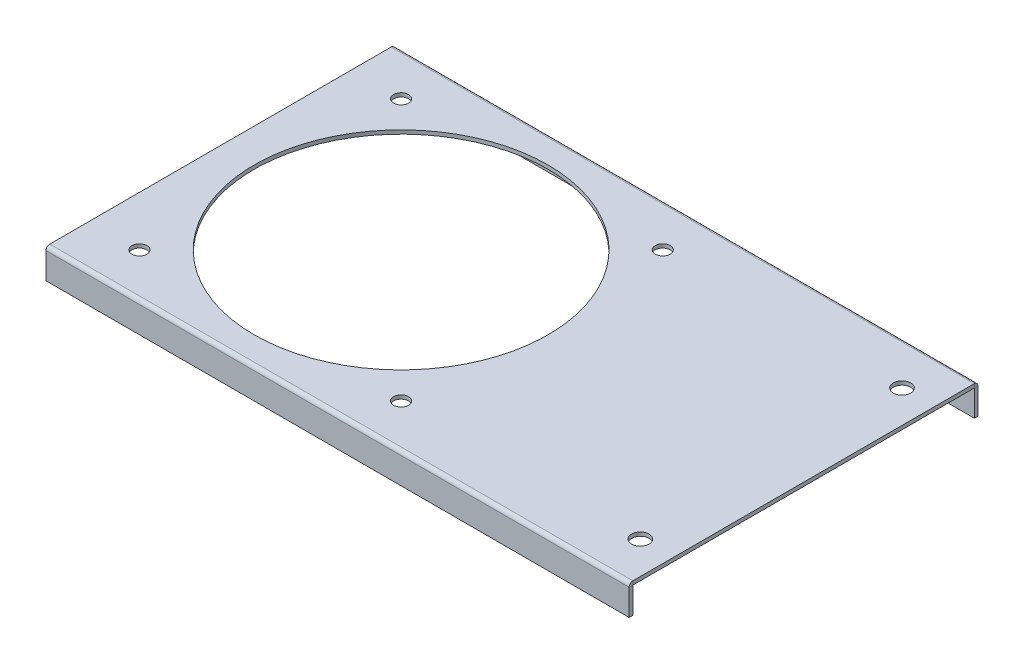
ISO-10303-21;
HEADER;
FILE_DESCRIPTION(('STEP AP214'),'2;1');
FILE_NAME('part.step','',(''),(''),'','','');
FILE_SCHEMA(('AUTOMOTIVE_DESIGN { 1 0 10303 214 1 1 1 1 }'));
ENDSEC;
DATA;
#1=APPLICATION_CONTEXT('core data for automotive mechanical design processes');
#2=APPLICATION_PROTOCOL_DEFINITION('international standard','automotive_design',2000,#1);
#3=PRODUCT_CONTEXT('',#1,'mechanical');
#4=PRODUCT('Part','Part','',(#3));
#5=PRODUCT_RELATED_PRODUCT_CATEGORY('part','',(#4));
#6=PRODUCT_DEFINITION_FORMATION('','',#4);
#7=PRODUCT_DEFINITION_CONTEXT('part definition',#1,'design');
#8=PRODUCT_DEFINITION('design','',#6,#7);
#9=PRODUCT_DEFINITION_SHAPE('','',#8);
#10=(LENGTH_UNIT() NAMED_UNIT(*) SI_UNIT(.MILLI.,.METRE.));
#11=(NAMED_UNIT(*) PLANE_ANGLE_UNIT() SI_UNIT($,.RADIAN.));
#12=(NAMED_UNIT(*) SI_UNIT($,.STERADIAN.) SOLID_ANGLE_UNIT());
#13=UNCERTAINTY_MEASURE_WITH_UNIT(LENGTH_MEASURE(1.E-05),#10,'distance_accuracy_value','');
#14=(GEOMETRIC_REPRESENTATION_CONTEXT(3) GLOBAL_UNCERTAINTY_ASSIGNED_CONTEXT((#13)) GLOBAL_UNIT_ASSIGNED_CONTEXT((#10,
#11,#12)) REPRESENTATION_CONTEXT('',''));
#15=CARTESIAN_POINT('',(0.,0.,0.));
#16=DIRECTION('',(0.,0.,1.));
#17=DIRECTION('',(1.,0.,0.));
#18=AXIS2_PLACEMENT_3D('',#15,#16,#17);
#19=CARTESIAN_POINT('',(117.,-1.5,68.5));
#20=DIRECTION('',(1.,0.,0.));
#21=DIRECTION('',(0.,0.,-1.));
#22=AXIS2_PLACEMENT_3D('',#19,#20,#21);
#23=PLANE('',#22);
#24=DIRECTION('',(0.,1.,0.));
#25=VECTOR('',#24,1.);
#26=CARTESIAN_POINT('',(117.,-1.5,68.5));
#27=LINE('',#26,#25);
#28=CARTESIAN_POINT('',(117.,-1.5,68.5));
#29=VERTEX_POINT('',#28);
#30=CARTESIAN_POINT('',(117.,0.,68.5));
#31=VERTEX_POINT('',#30);
#32=EDGE_CURVE('E11',#29,#31,#27,.T.);
#33=ORIENTED_EDGE('',*,*,#32,.F.);
#34=DIRECTION('',(0.,0.,-1.));
#35=VECTOR('',#34,1.);
#36=CARTESIAN_POINT('',(117.,-1.5,70.));
#37=LINE('',#36,#35);
#38=CARTESIAN_POINT('',(117.,-1.49999999999998,-68.5));
#39=VERTEX_POINT('',#38);
#40=EDGE_CURVE('E141',#29,#39,#37,.T.);
#41=ORIENTED_EDGE('',*,*,#40,.T.);
#42=DIRECTION('',(0.,1.,0.));
#43=VECTOR('',#42,1.);
#44=CARTESIAN_POINT('',(117.,-1.49999999999998,-68.5));
#45=LINE('',#44,#43);
#46=CARTESIAN_POINT('',(117.,0.,-68.5));
#47=VERTEX_POINT('',#46);
#48=EDGE_CURVE('E204',#39,#47,#45,.T.);
#49=ORIENTED_EDGE('',*,*,#48,.T.);
#50=DIRECTION('',(0.,0.,-1.));
#51=VECTOR('',#50,1.);
#52=CARTESIAN_POINT('',(117.,0.,70.));
#53=LINE('',#52,#51);
#54=EDGE_CURVE('E262',#31,#47,#53,.T.);
#55=ORIENTED_EDGE('',*,*,#54,.F.);
#56=EDGE_LOOP('',(#33,#41,#49,#55));
#57=FACE_BOUND('',#56,.T.);
#58=ADVANCED_FACE('F35',(#57),#23,.T.);
#59=CARTESIAN_POINT('',(117.,-1.5,68.5));
#60=DIRECTION('',(1.,0.,0.));
#61=DIRECTION('',(0.,0.,-1.));
#62=AXIS2_PLACEMENT_3D('',#59,#60,#61);
#63=PLANE('',#62);
#64=DIRECTION('',(0.,0.,1.));
#65=VECTOR('',#64,1.);
#66=CARTESIAN_POINT('',(117.,-1.5,68.5));
#67=LINE('',#66,#65);
#68=CARTESIAN_POINT('',(117.,-1.5,70.));
#69=VERTEX_POINT('',#68);
#70=EDGE_CURVE('E44',#29,#69,#67,.T.);
#71=ORIENTED_EDGE('',*,*,#70,.F.);
#72=ORIENTED_EDGE('',*,*,#32,.T.);
#73=CARTESIAN_POINT('',(117.,-1.5,68.5));
#74=DIRECTION('',(1.,0.,0.));
#75=DIRECTION('',(0.,0.,-1.));
#76=AXIS2_PLACEMENT_3D('',#73,#74,#75);
#77=CIRCLE('',#76,1.5);
#78=EDGE_CURVE('E148',#69,#31,#77,.F.);
#79=ORIENTED_EDGE('',*,*,#78,.F.);
#80=EDGE_LOOP('',(#71,#72,#79));
#81=FACE_BOUND('',#80,.T.);
#82=ADVANCED_FACE('F274',(#81),#63,.T.);
#83=CARTESIAN_POINT('',(-117.,-1.5,68.5));
#84=DIRECTION('',(-1.,0.,0.));
#85=DIRECTION('',(0.,0.,1.));
#86=AXIS2_PLACEMENT_3D('',#83,#84,#85);
#87=PLANE('',#86);
#88=DIRECTION('',(0.,0.,1.));
#89=VECTOR('',#88,1.);
#90=CARTESIAN_POINT('',(-117.,-1.5,68.5));
#91=LINE('',#90,#89);
#92=CARTESIAN_POINT('',(-117.,-1.5,68.5));
#93=VERTEX_POINT('',#92);
#94=CARTESIAN_POINT('',(-117.,-1.5,70.));
#95=VERTEX_POINT('',#94);
#96=EDGE_CURVE('E88',#93,#95,#91,.T.);
#97=ORIENTED_EDGE('',*,*,#96,.F.);
#98=DIRECTION('',(0.,1.,0.));
#99=VECTOR('',#98,1.);
#100=CARTESIAN_POINT('',(-117.,-12.,68.5));
#101=LINE('',#100,#99);
#102=CARTESIAN_POINT('',(-117.,-12.,68.5));
#103=VERTEX_POINT('',#102);
#104=EDGE_CURVE('E176',#103,#93,#101,.T.);
#105=ORIENTED_EDGE('',*,*,#104,.F.);
#106=DIRECTION('',(0.,0.,1.));
#107=VECTOR('',#106,1.);
#108=CARTESIAN_POINT('',(-117.,-12.,68.5));
#109=LINE('',#108,#107);
#110=CARTESIAN_POINT('',(-117.,-12.,70.));
#111=VERTEX_POINT('',#110);
#112=EDGE_CURVE('E128',#103,#111,#109,.T.);
#113=ORIENTED_EDGE('',*,*,#112,.T.);
#114=DIRECTION('',(0.,1.,0.));
#115=VECTOR('',#114,1.);
#116=CARTESIAN_POINT('',(-117.,-12.,70.));
#117=LINE('',#116,#115);
#118=EDGE_CURVE('E173',#111,#95,#117,.T.);
#119=ORIENTED_EDGE('',*,*,#118,.T.);
#120=EDGE_LOOP('',(#97,#105,#113,#119));
#121=FACE_BOUND('',#120,.T.);
#122=ADVANCED_FACE('F278',(#121),#87,.T.);
#123=CARTESIAN_POINT('',(-117.,-1.5,68.5));
#124=DIRECTION('',(-1.,0.,0.));
#125=DIRECTION('',(0.,0.,1.));
#126=AXIS2_PLACEMENT_3D('',#123,#124,#125);
#127=PLANE('',#126);
#128=DIRECTION('',(0.,1.,0.));
#129=VECTOR('',#128,1.);
#130=CARTESIAN_POINT('',(-117.,-1.5,68.5));
#131=LINE('',#130,#129);
#132=CARTESIAN_POINT('',(-117.,0.,68.5));
#133=VERTEX_POINT('',#132);
#134=EDGE_CURVE('E207',#93,#133,#131,.T.);
#135=ORIENTED_EDGE('',*,*,#134,.F.);
#136=ORIENTED_EDGE('',*,*,#96,.T.);
#137=CARTESIAN_POINT('',(-117.,-1.5,68.5));
#138=DIRECTION('',(1.,0.,0.));
#139=DIRECTION('',(0.,0.,-1.));
#140=AXIS2_PLACEMENT_3D('',#137,#138,#139);
#141=CIRCLE('',#140,1.5);
#142=EDGE_CURVE('E170',#95,#133,#141,.F.);
#143=ORIENTED_EDGE('',*,*,#142,.T.);
#144=EDGE_LOOP('',(#135,#136,#143));
#145=FACE_BOUND('',#144,.T.);
#146=ADVANCED_FACE('F284',(#145),#127,.T.);
#147=CARTESIAN_POINT('',(117.,-1.49999999999998,-68.5));
#148=DIRECTION('',(1.,0.,0.));
#149=DIRECTION('',(0.,0.,-1.));
#150=AXIS2_PLACEMENT_3D('',#147,#148,#149);
#151=PLANE('',#150);
#152=DIRECTION('',(0.,0.,-1.));
#153=VECTOR('',#152,1.);
#154=CARTESIAN_POINT('',(117.,-1.49999999999998,-68.5));
#155=LINE('',#154,#153);
#156=CARTESIAN_POINT('',(117.,-1.49999999999998,-70.));
#157=VERTEX_POINT('',#156);
#158=EDGE_CURVE('E53',#39,#157,#155,.T.);
#159=ORIENTED_EDGE('',*,*,#158,.F.);
#160=DIRECTION('',(0.,1.,0.));
#161=VECTOR('',#160,1.);
#162=CARTESIAN_POINT('',(117.,0.,-68.5));
#163=LINE('',#162,#161);
#164=CARTESIAN_POINT('',(117.,-12.,-68.5));
#165=VERTEX_POINT('',#164);
#166=EDGE_CURVE('E101',#39,#165,#163,.F.);
#167=ORIENTED_EDGE('',*,*,#166,.T.);
#168=DIRECTION('',(0.,0.,1.));
#169=VECTOR('',#168,1.);
#170=CARTESIAN_POINT('',(117.,-12.,-70.));
#171=LINE('',#170,#169);
#172=CARTESIAN_POINT('',(117.,-12.,-70.));
#173=VERTEX_POINT('',#172);
#174=EDGE_CURVE('E253',#173,#165,#171,.T.);
#175=ORIENTED_EDGE('',*,*,#174,.F.);
#176=DIRECTION('',(0.,-1.,0.));
#177=VECTOR('',#176,1.);
#178=CARTESIAN_POINT('',(117.,0.,-70.));
#179=LINE('',#178,#177);
#180=EDGE_CURVE('E256',#157,#173,#179,.T.);
#181=ORIENTED_EDGE('',*,*,#180,.F.);
#182=EDGE_LOOP('',(#159,#167,#175,#181));
#183=FACE_BOUND('',#182,.T.);
#184=ADVANCED_FACE('F286',(#183),#151,.T.);
#185=CARTESIAN_POINT('',(117.,-1.49999999999998,-68.5));
#186=DIRECTION('',(1.,0.,0.));
#187=DIRECTION('',(0.,0.,-1.));
#188=AXIS2_PLACEMENT_3D('',#185,#186,#187);
#189=PLANE('',#188);
#190=ORIENTED_EDGE('',*,*,#48,.F.);
#191=ORIENTED_EDGE('',*,*,#158,.T.);
#192=CARTESIAN_POINT('',(117.,-1.49999999999998,-68.5));
#193=DIRECTION('',(1.,0.,0.));
#194=DIRECTION('',(0.,0.,-1.));
#195=AXIS2_PLACEMENT_3D('',#192,#193,#194);
#196=CIRCLE('',#195,1.5);
#197=EDGE_CURVE('E259',#47,#157,#196,.F.);
#198=ORIENTED_EDGE('',*,*,#197,.F.);
#199=EDGE_LOOP('',(#190,#191,#198));
#200=FACE_BOUND('',#199,.T.);
#201=ADVANCED_FACE('F292',(#200),#189,.T.);
#202=CARTESIAN_POINT('',(-117.,-1.49999999999998,-68.5));
#203=DIRECTION('',(-1.,0.,0.));
#204=DIRECTION('',(0.,0.,1.));
#205=AXIS2_PLACEMENT_3D('',#202,#203,#204);
#206=PLANE('',#205);
#207=DIRECTION('',(0.,1.,0.));
#208=VECTOR('',#207,1.);
#209=CARTESIAN_POINT('',(-117.,-1.49999999999998,-68.5));
#210=LINE('',#209,#208);
#211=CARTESIAN_POINT('',(-117.,-1.49999999999998,-68.5));
#212=VERTEX_POINT('',#211);
#213=CARTESIAN_POINT('',(-117.,0.,-68.5));
#214=VERTEX_POINT('',#213);
#215=EDGE_CURVE('E95',#212,#214,#210,.T.);
#216=ORIENTED_EDGE('',*,*,#215,.F.);
#217=DIRECTION('',(0.,0.,-1.));
#218=VECTOR('',#217,1.);
#219=CARTESIAN_POINT('',(-117.,-1.5,70.));
#220=LINE('',#219,#218);
#221=EDGE_CURVE('E178',#93,#212,#220,.T.);
#222=ORIENTED_EDGE('',*,*,#221,.F.);
#223=ORIENTED_EDGE('',*,*,#134,.T.);
#224=DIRECTION('',(0.,0.,-1.));
#225=VECTOR('',#224,1.);
#226=CARTESIAN_POINT('',(-117.,0.,70.));
#227=LINE('',#226,#225);
#228=EDGE_CURVE('E168',#133,#214,#227,.T.);
#229=ORIENTED_EDGE('',*,*,#228,.T.);
#230=EDGE_LOOP('',(#216,#222,#223,#229));
#231=FACE_BOUND('',#230,.T.);
#232=ADVANCED_FACE('F282',(#231),#206,.T.);
#233=CARTESIAN_POINT('',(-117.,-1.49999999999998,-68.5));
#234=DIRECTION('',(-1.,0.,0.));
#235=DIRECTION('',(0.,0.,1.));
#236=AXIS2_PLACEMENT_3D('',#233,#234,#235);
#237=PLANE('',#236);
#238=DIRECTION('',(0.,0.,-1.));
#239=VECTOR('',#238,1.);
#240=CARTESIAN_POINT('',(-117.,-1.49999999999998,-68.5));
#241=LINE('',#240,#239);
#242=CARTESIAN_POINT('',(-117.,-1.49999999999998,-70.));
#243=VERTEX_POINT('',#242);
#244=EDGE_CURVE('E201',#212,#243,#241,.T.);
#245=ORIENTED_EDGE('',*,*,#244,.F.);
#246=ORIENTED_EDGE('',*,*,#215,.T.);
#247=CARTESIAN_POINT('',(-117.,-1.49999999999998,-68.5));
#248=DIRECTION('',(1.,0.,0.));
#249=DIRECTION('',(0.,0.,-1.));
#250=AXIS2_PLACEMENT_3D('',#247,#248,#249);
#251=CIRCLE('',#250,1.5);
#252=EDGE_CURVE('E165',#214,#243,#251,.F.);
#253=ORIENTED_EDGE('',*,*,#252,.T.);
#254=EDGE_LOOP('',(#245,#246,#253));
#255=FACE_BOUND('',#254,.T.);
#256=ADVANCED_FACE('F311',(#255),#237,.T.);
#257=CARTESIAN_POINT('',(117.,0.,-68.5));
#258=DIRECTION('',(0.,0.,-1.));
#259=DIRECTION('',(-1.,0.,0.));
#260=AXIS2_PLACEMENT_3D('',#257,#258,#259);
#261=PLANE('',#260);
#262=DIRECTION('',(0.,1.,0.));
#263=VECTOR('',#262,1.);
#264=CARTESIAN_POINT('',(-117.,0.,-68.5));
#265=LINE('',#264,#263);
#266=CARTESIAN_POINT('',(-117.,-12.,-68.5));
#267=VERTEX_POINT('',#266);
#268=EDGE_CURVE('E155',#212,#267,#265,.F.);
#269=ORIENTED_EDGE('',*,*,#268,.T.);
#270=DIRECTION('',(-1.,0.,0.));
#271=VECTOR('',#270,1.);
#272=CARTESIAN_POINT('',(117.,-12.,-68.5));
#273=LINE('',#272,#271);
#274=EDGE_CURVE('E199',#165,#267,#273,.T.);
#275=ORIENTED_EDGE('',*,*,#274,.F.);
#276=ORIENTED_EDGE('',*,*,#166,.F.);
#277=DIRECTION('',(-1.,0.,0.));
#278=VECTOR('',#277,1.);
#279=CARTESIAN_POINT('',(117.,-1.49999999999998,-68.5));
#280=LINE('',#279,#278);
#281=EDGE_CURVE('E154',#39,#212,#280,.T.);
#282=ORIENTED_EDGE('',*,*,#281,.T.);
#283=EDGE_LOOP('',(#269,#275,#276,#282));
#284=FACE_BOUND('',#283,.T.);
#285=ADVANCED_FACE('F317',(#284),#261,.F.);
#286=CARTESIAN_POINT('',(117.,-12.,-70.));
#287=DIRECTION('',(0.,-1.,0.));
#288=DIRECTION('',(0.,0.,-1.));
#289=AXIS2_PLACEMENT_3D('',#286,#287,#288);
#290=PLANE('',#289);
#291=DIRECTION('',(0.,0.,1.));
#292=VECTOR('',#291,1.);
#293=CARTESIAN_POINT('',(-117.,-12.,-70.));
#294=LINE('',#293,#292);
#295=CARTESIAN_POINT('',(-117.,-12.,-70.));
#296=VERTEX_POINT('',#295);
#297=EDGE_CURVE('E158',#296,#267,#294,.T.);
#298=ORIENTED_EDGE('',*,*,#297,.F.);
#299=DIRECTION('',(-1.,0.,0.));
#300=VECTOR('',#299,1.);
#301=CARTESIAN_POINT('',(117.,-12.,-70.));
#302=LINE('',#301,#300);
#303=EDGE_CURVE('E197',#173,#296,#302,.T.);
#304=ORIENTED_EDGE('',*,*,#303,.F.);
#305=ORIENTED_EDGE('',*,*,#174,.T.);
#306=ORIENTED_EDGE('',*,*,#274,.T.);
#307=EDGE_LOOP('',(#298,#304,#305,#306));
#308=FACE_BOUND('',#307,.T.);
#309=ADVANCED_FACE('F319',(#308),#290,.T.);
#310=CARTESIAN_POINT('',(117.,0.,-70.));
#311=DIRECTION('',(0.,0.,-1.));
#312=DIRECTION('',(-1.,0.,0.));
#313=AXIS2_PLACEMENT_3D('',#310,#311,#312);
#314=PLANE('',#313);
#315=DIRECTION('',(0.,-1.,0.));
#316=VECTOR('',#315,1.);
#317=CARTESIAN_POINT('',(-117.,0.,-70.));
#318=LINE('',#317,#316);
#319=EDGE_CURVE('E162',#243,#296,#318,.T.);
#320=ORIENTED_EDGE('',*,*,#319,.F.);
#321=DIRECTION('',(-1.,0.,0.));
#322=VECTOR('',#321,1.);
#323=CARTESIAN_POINT('',(117.,-1.49999999999998,-70.));
#324=LINE('',#323,#322);
#325=EDGE_CURVE('E194',#157,#243,#324,.T.);
#326=ORIENTED_EDGE('',*,*,#325,.F.);
#327=ORIENTED_EDGE('',*,*,#180,.T.);
#328=ORIENTED_EDGE('',*,*,#303,.T.);
#329=EDGE_LOOP('',(#320,#326,#327,#328));
#330=FACE_BOUND('',#329,.T.);
#331=ADVANCED_FACE('F321',(#330),#314,.T.);
#332=CARTESIAN_POINT('',(117.,-1.49999999999998,-68.5));
#333=DIRECTION('',(-1.,0.,0.));
#334=DIRECTION('',(0.,0.,1.));
#335=AXIS2_PLACEMENT_3D('',#332,#333,#334);
#336=CYLINDRICAL_SURFACE('',#335,1.5);
#337=ORIENTED_EDGE('',*,*,#252,.F.);
#338=DIRECTION('',(-1.,0.,0.));
#339=VECTOR('',#338,1.);
#340=CARTESIAN_POINT('',(117.,0.,-68.5));
#341=LINE('',#340,#339);
#342=EDGE_CURVE('E191',#47,#214,#341,.T.);
#343=ORIENTED_EDGE('',*,*,#342,.F.);
#344=ORIENTED_EDGE('',*,*,#197,.T.);
#345=ORIENTED_EDGE('',*,*,#325,.T.);
#346=EDGE_LOOP('',(#337,#343,#344,#345));
#347=FACE_BOUND('',#346,.T.);
#348=ADVANCED_FACE('F307',(#347),#336,.T.);
#349=CARTESIAN_POINT('',(117.,0.,70.));
#350=DIRECTION('',(0.,1.,0.));
#351=DIRECTION('',(0.,0.,1.));
#352=AXIS2_PLACEMENT_3D('',#349,#350,#351);
#353=PLANE('',#352);
#354=CARTESIAN_POINT('',(104.,0.,52.5));
#355=DIRECTION('',(0.,1.,0.));
#356=DIRECTION('',(0.,0.,1.));
#357=AXIS2_PLACEMENT_3D('',#354,#355,#356);
#358=CIRCLE('',#357,3.50000000000001);
#359=CARTESIAN_POINT('',(104.,0.,56.));
#360=VERTEX_POINT('',#359);
#361=EDGE_CURVE('E241',#360,#360,#358,.T.);
#362=ORIENTED_EDGE('',*,*,#361,.F.);
#363=EDGE_LOOP('',(#362));
#364=FACE_BOUND('',#363,.T.);
#365=CARTESIAN_POINT('',(104.,0.,-52.5));
#366=DIRECTION('',(0.,1.,0.));
#367=DIRECTION('',(0.,0.,1.));
#368=AXIS2_PLACEMENT_3D('',#365,#366,#367);
#369=CIRCLE('',#368,3.50000000000001);
#370=CARTESIAN_POINT('',(104.,0.,-49.));
#371=VERTEX_POINT('',#370);
#372=EDGE_CURVE('E231',#371,#371,#369,.T.);
#373=ORIENTED_EDGE('',*,*,#372,.F.);
#374=EDGE_LOOP('',(#373));
#375=FACE_BOUND('',#374,.T.);
#376=CARTESIAN_POINT('',(-97.,0.,52.5));
#377=DIRECTION('',(0.,1.,0.));
#378=DIRECTION('',(0.,0.,1.));
#379=AXIS2_PLACEMENT_3D('',#376,#377,#378);
#380=CIRCLE('',#379,3.00000000000001);
#381=CARTESIAN_POINT('',(-97.,0.,55.5));
#382=VERTEX_POINT('',#381);
#383=EDGE_CURVE('E228',#382,#382,#380,.T.);
#384=ORIENTED_EDGE('',*,*,#383,.F.);
#385=EDGE_LOOP('',(#384));
#386=FACE_BOUND('',#385,.T.);
#387=CARTESIAN_POINT('',(7.99999999999999,0.,52.5));
#388=DIRECTION('',(0.,1.,0.));
#389=DIRECTION('',(0.,0.,1.));
#390=AXIS2_PLACEMENT_3D('',#387,#388,#389);
#391=CIRCLE('',#390,3.);
#392=CARTESIAN_POINT('',(7.99999999999999,0.,55.5));
#393=VERTEX_POINT('',#392);
#394=EDGE_CURVE('E225',#393,#393,#391,.T.);
#395=ORIENTED_EDGE('',*,*,#394,.F.);
#396=EDGE_LOOP('',(#395));
#397=FACE_BOUND('',#396,.T.);
#398=CARTESIAN_POINT('',(7.99999999999998,0.,-52.5));
#399=DIRECTION('',(0.,1.,0.));
#400=DIRECTION('',(0.,0.,1.));
#401=AXIS2_PLACEMENT_3D('',#398,#399,#400);
#402=CIRCLE('',#401,3.);
#403=CARTESIAN_POINT('',(7.99999999999998,0.,-49.5));
#404=VERTEX_POINT('',#403);
#405=EDGE_CURVE('E221',#404,#404,#402,.T.);
#406=ORIENTED_EDGE('',*,*,#405,.F.);
#407=EDGE_LOOP('',(#406));
#408=FACE_BOUND('',#407,.T.);
#409=CARTESIAN_POINT('',(-97.,0.,-52.5));
#410=DIRECTION('',(0.,1.,0.));
#411=DIRECTION('',(0.,0.,1.));
#412=AXIS2_PLACEMENT_3D('',#409,#410,#411);
#413=CIRCLE('',#412,3.00000000000001);
#414=CARTESIAN_POINT('',(-97.,0.,-49.5));
#415=VERTEX_POINT('',#414);
#416=EDGE_CURVE('E217',#415,#415,#413,.T.);
#417=ORIENTED_EDGE('',*,*,#416,.F.);
#418=EDGE_LOOP('',(#417));
#419=FACE_BOUND('',#418,.T.);
#420=CARTESIAN_POINT('',(-44.5,0.,0.));
#421=DIRECTION('',(0.,1.,0.));
#422=DIRECTION('',(0.,0.,1.));
#423=AXIS2_PLACEMENT_3D('',#420,#421,#422);
#424=CIRCLE('',#423,59.);
#425=CARTESIAN_POINT('',(-44.5,0.,59.));
#426=VERTEX_POINT('',#425);
#427=EDGE_CURVE('E213',#426,#426,#424,.T.);
#428=ORIENTED_EDGE('',*,*,#427,.F.);
#429=EDGE_LOOP('',(#428));
#430=FACE_BOUND('',#429,.T.);
#431=ORIENTED_EDGE('',*,*,#228,.F.);
#432=DIRECTION('',(-1.,0.,0.));
#433=VECTOR('',#432,1.);
#434=CARTESIAN_POINT('',(117.,0.,68.5));
#435=LINE('',#434,#433);
#436=EDGE_CURVE('E188',#31,#133,#435,.T.);
#437=ORIENTED_EDGE('',*,*,#436,.F.);
#438=ORIENTED_EDGE('',*,*,#54,.T.);
#439=ORIENTED_EDGE('',*,*,#342,.T.);
#440=EDGE_LOOP('',(#431,#437,#438,#439));
#441=FACE_BOUND('',#440,.T.);
#442=ADVANCED_FACE('F303',(#364,#375,#386,#397,#408,#419,#430,#441),#353,.T.);
#443=CARTESIAN_POINT('',(117.,-1.5,68.5));
#444=DIRECTION('',(-1.,0.,0.));
#445=DIRECTION('',(0.,0.,1.));
#446=AXIS2_PLACEMENT_3D('',#443,#444,#445);
#447=CYLINDRICAL_SURFACE('',#446,1.5);
#448=ORIENTED_EDGE('',*,*,#142,.F.);
#449=DIRECTION('',(-1.,0.,0.));
#450=VECTOR('',#449,1.);
#451=CARTESIAN_POINT('',(117.,-1.5,70.));
#452=LINE('',#451,#450);
#453=EDGE_CURVE('E185',#69,#95,#452,.T.);
#454=ORIENTED_EDGE('',*,*,#453,.F.);
#455=ORIENTED_EDGE('',*,*,#78,.T.);
#456=ORIENTED_EDGE('',*,*,#436,.T.);
#457=EDGE_LOOP('',(#448,#454,#455,#456));
#458=FACE_BOUND('',#457,.T.);
#459=ADVANCED_FACE('F269',(#458),#447,.T.);
#460=CARTESIAN_POINT('',(117.,-12.,70.));
#461=DIRECTION('',(0.,0.,1.));
#462=DIRECTION('',(0.,-1.,0.));
#463=AXIS2_PLACEMENT_3D('',#460,#461,#462);
#464=PLANE('',#463);
#465=ORIENTED_EDGE('',*,*,#118,.F.);
#466=DIRECTION('',(-1.,0.,0.));
#467=VECTOR('',#466,1.);
#468=CARTESIAN_POINT('',(117.,-12.,70.));
#469=LINE('',#468,#467);
#470=CARTESIAN_POINT('',(117.,-12.,70.));
#471=VERTEX_POINT('',#470);
#472=EDGE_CURVE('E131',#471,#111,#469,.T.);
#473=ORIENTED_EDGE('',*,*,#472,.F.);
#474=DIRECTION('',(0.,1.,0.));
#475=VECTOR('',#474,1.);
#476=CARTESIAN_POINT('',(117.,-12.,70.));
#477=LINE('',#476,#475);
#478=EDGE_CURVE('E146',#471,#69,#477,.T.);
#479=ORIENTED_EDGE('',*,*,#478,.T.);
#480=ORIENTED_EDGE('',*,*,#453,.T.);
#481=EDGE_LOOP('',(#465,#473,#479,#480));
#482=FACE_BOUND('',#481,.T.);
#483=ADVANCED_FACE('F277',(#482),#464,.T.);
#484=CARTESIAN_POINT('',(117.,-12.,68.5));
#485=DIRECTION('',(0.,-1.,0.));
#486=DIRECTION('',(0.,0.,-1.));
#487=AXIS2_PLACEMENT_3D('',#484,#485,#486);
#488=PLANE('',#487);
#489=ORIENTED_EDGE('',*,*,#112,.F.);
#490=DIRECTION('',(-1.,0.,0.));
#491=VECTOR('',#490,1.);
#492=CARTESIAN_POINT('',(117.,-12.,68.5));
#493=LINE('',#492,#491);
#494=CARTESIAN_POINT('',(117.,-12.,68.5));
#495=VERTEX_POINT('',#494);
#496=EDGE_CURVE('E122',#495,#103,#493,.T.);
#497=ORIENTED_EDGE('',*,*,#496,.F.);
#498=DIRECTION('',(0.,0.,1.));
#499=VECTOR('',#498,1.);
#500=CARTESIAN_POINT('',(117.,-12.,68.5));
#501=LINE('',#500,#499);
#502=EDGE_CURVE('E126',#495,#471,#501,.T.);
#503=ORIENTED_EDGE('',*,*,#502,.T.);
#504=ORIENTED_EDGE('',*,*,#472,.T.);
#505=EDGE_LOOP('',(#489,#497,#503,#504));
#506=FACE_BOUND('',#505,.T.);
#507=ADVANCED_FACE('F124',(#506),#488,.T.);
#508=CARTESIAN_POINT('',(117.,-12.,68.5));
#509=DIRECTION('',(0.,0.,1.));
#510=DIRECTION('',(0.,-1.,0.));
#511=AXIS2_PLACEMENT_3D('',#508,#509,#510);
#512=PLANE('',#511);
#513=ORIENTED_EDGE('',*,*,#104,.T.);
#514=DIRECTION('',(-1.,0.,0.));
#515=VECTOR('',#514,1.);
#516=CARTESIAN_POINT('',(117.,-1.5,68.5));
#517=LINE('',#516,#515);
#518=EDGE_CURVE('E132',#29,#93,#517,.T.);
#519=ORIENTED_EDGE('',*,*,#518,.F.);
#520=DIRECTION('',(0.,1.,0.));
#521=VECTOR('',#520,1.);
#522=CARTESIAN_POINT('',(117.,-12.,68.5));
#523=LINE('',#522,#521);
#524=EDGE_CURVE('E136',#495,#29,#523,.T.);
#525=ORIENTED_EDGE('',*,*,#524,.F.);
#526=ORIENTED_EDGE('',*,*,#496,.T.);
#527=EDGE_LOOP('',(#513,#519,#525,#526));
#528=FACE_BOUND('',#527,.T.);
#529=ADVANCED_FACE('F137',(#528),#512,.F.);
#530=CARTESIAN_POINT('',(117.,-1.5,70.));
#531=DIRECTION('',(0.,1.,0.));
#532=DIRECTION('',(0.,0.,1.));
#533=AXIS2_PLACEMENT_3D('',#530,#531,#532);
#534=PLANE('',#533);
#535=CARTESIAN_POINT('',(104.,-1.5,52.5));
#536=DIRECTION('',(0.,1.,0.));
#537=DIRECTION('',(0.,0.,1.));
#538=AXIS2_PLACEMENT_3D('',#535,#536,#537);
#539=CIRCLE('',#538,3.50000000000001);
#540=CARTESIAN_POINT('',(104.,-1.5,56.));
#541=VERTEX_POINT('',#540);
#542=EDGE_CURVE('E38',#541,#541,#539,.T.);
#543=ORIENTED_EDGE('',*,*,#542,.T.);
#544=EDGE_LOOP('',(#543));
#545=FACE_BOUND('',#544,.T.);
#546=CARTESIAN_POINT('',(104.,-1.49999999999998,-52.5));
#547=DIRECTION('',(0.,1.,0.));
#548=DIRECTION('',(0.,0.,1.));
#549=AXIS2_PLACEMENT_3D('',#546,#547,#548);
#550=CIRCLE('',#549,3.50000000000001);
#551=CARTESIAN_POINT('',(104.,-1.49999999999998,-49.));
#552=VERTEX_POINT('',#551);
#553=EDGE_CURVE('E229',#552,#552,#550,.T.);
#554=ORIENTED_EDGE('',*,*,#553,.T.);
#555=EDGE_LOOP('',(#554));
#556=FACE_BOUND('',#555,.T.);
#557=CARTESIAN_POINT('',(-97.,-1.5,52.5));
#558=DIRECTION('',(0.,1.,0.));
#559=DIRECTION('',(0.,0.,1.));
#560=AXIS2_PLACEMENT_3D('',#557,#558,#559);
#561=CIRCLE('',#560,3.00000000000001);
#562=CARTESIAN_POINT('',(-97.,-1.5,55.5));
#563=VERTEX_POINT('',#562);
#564=EDGE_CURVE('E226',#563,#563,#561,.T.);
#565=ORIENTED_EDGE('',*,*,#564,.T.);
#566=EDGE_LOOP('',(#565));
#567=FACE_BOUND('',#566,.T.);
#568=CARTESIAN_POINT('',(7.99999999999999,-1.5,52.5));
#569=DIRECTION('',(0.,1.,0.));
#570=DIRECTION('',(0.,0.,1.));
#571=AXIS2_PLACEMENT_3D('',#568,#569,#570);
#572=CIRCLE('',#571,3.);
#573=CARTESIAN_POINT('',(7.99999999999999,-1.5,55.5));
#574=VERTEX_POINT('',#573);
#575=EDGE_CURVE('E222',#574,#574,#572,.T.);
#576=ORIENTED_EDGE('',*,*,#575,.T.);
#577=EDGE_LOOP('',(#576));
#578=FACE_BOUND('',#577,.T.);
#579=CARTESIAN_POINT('',(7.99999999999998,-1.49999999999998,-52.5));
#580=DIRECTION('',(0.,1.,0.));
#581=DIRECTION('',(0.,0.,1.));
#582=AXIS2_PLACEMENT_3D('',#579,#580,#581);
#583=CIRCLE('',#582,3.);
#584=CARTESIAN_POINT('',(7.99999999999998,-1.49999999999998,-49.5));
#585=VERTEX_POINT('',#584);
#586=EDGE_CURVE('E218',#585,#585,#583,.T.);
#587=ORIENTED_EDGE('',*,*,#586,.T.);
#588=EDGE_LOOP('',(#587));
#589=FACE_BOUND('',#588,.T.);
#590=CARTESIAN_POINT('',(-97.,-1.49999999999998,-52.5));
#591=DIRECTION('',(0.,1.,0.));
#592=DIRECTION('',(0.,0.,1.));
#593=AXIS2_PLACEMENT_3D('',#590,#591,#592);
#594=CIRCLE('',#593,3.00000000000001);
#595=CARTESIAN_POINT('',(-97.,-1.49999999999998,-49.5));
#596=VERTEX_POINT('',#595);
#597=EDGE_CURVE('E214',#596,#596,#594,.T.);
#598=ORIENTED_EDGE('',*,*,#597,.T.);
#599=EDGE_LOOP('',(#598));
#600=FACE_BOUND('',#599,.T.);
#601=CARTESIAN_POINT('',(-44.5,-1.49999999999999,0.));
#602=DIRECTION('',(0.,1.,0.));
#603=DIRECTION('',(0.,0.,1.));
#604=AXIS2_PLACEMENT_3D('',#601,#602,#603);
#605=CIRCLE('',#604,59.);
#606=CARTESIAN_POINT('',(-44.5,-1.5,59.));
#607=VERTEX_POINT('',#606);
#608=EDGE_CURVE('E159',#607,#607,#605,.T.);
#609=ORIENTED_EDGE('',*,*,#608,.T.);
#610=EDGE_LOOP('',(#609));
#611=FACE_BOUND('',#610,.T.);
#612=ORIENTED_EDGE('',*,*,#221,.T.);
#613=ORIENTED_EDGE('',*,*,#281,.F.);
#614=ORIENTED_EDGE('',*,*,#40,.F.);
#615=ORIENTED_EDGE('',*,*,#518,.T.);
#616=EDGE_LOOP('',(#612,#613,#614,#615));
#617=FACE_BOUND('',#616,.T.);
#618=ADVANCED_FACE('F280',(#545,#556,#567,#578,#589,#600,#611,#617),#534,.F.);
#619=CARTESIAN_POINT('',(117.,-1.49999999999998,-68.5));
#620=DIRECTION('',(1.,0.,0.));
#621=DIRECTION('',(0.,0.,-1.));
#622=AXIS2_PLACEMENT_3D('',#619,#620,#621);
#623=PLANE('',#622);
#624=ORIENTED_EDGE('',*,*,#524,.T.);
#625=ORIENTED_EDGE('',*,*,#70,.T.);
#626=ORIENTED_EDGE('',*,*,#478,.F.);
#627=ORIENTED_EDGE('',*,*,#502,.F.);
#628=EDGE_LOOP('',(#624,#625,#626,#627));
#629=FACE_BOUND('',#628,.T.);
#630=ADVANCED_FACE('F144',(#629),#623,.T.);
#631=CARTESIAN_POINT('',(-117.,-1.49999999999998,-68.5));
#632=DIRECTION('',(1.,0.,0.));
#633=DIRECTION('',(0.,0.,-1.));
#634=AXIS2_PLACEMENT_3D('',#631,#632,#633);
#635=PLANE('',#634);
#636=ORIENTED_EDGE('',*,*,#268,.F.);
#637=ORIENTED_EDGE('',*,*,#244,.T.);
#638=ORIENTED_EDGE('',*,*,#319,.T.);
#639=ORIENTED_EDGE('',*,*,#297,.T.);
#640=EDGE_LOOP('',(#636,#637,#638,#639));
#641=FACE_BOUND('',#640,.T.);
#642=ADVANCED_FACE('F314',(#641),#635,.F.);
#643=CARTESIAN_POINT('',(-44.5,-12.,0.));
#644=DIRECTION('',(0.,1.,0.));
#645=DIRECTION('',(0.,0.,1.));
#646=AXIS2_PLACEMENT_3D('',#643,#644,#645);
#647=CYLINDRICAL_SURFACE('',#646,59.);
#648=ORIENTED_EDGE('',*,*,#427,.T.);
#649=EDGE_LOOP('',(#648));
#650=FACE_BOUND('',#649,.T.);
#651=ORIENTED_EDGE('',*,*,#608,.F.);
#652=EDGE_LOOP('',(#651));
#653=FACE_BOUND('',#652,.T.);
#654=ADVANCED_FACE('F431',(#650,#653),#647,.F.);
#655=CARTESIAN_POINT('',(-97.,-12.,-52.5));
#656=DIRECTION('',(0.,1.,0.));
#657=DIRECTION('',(0.,0.,1.));
#658=AXIS2_PLACEMENT_3D('',#655,#656,#657);
#659=CYLINDRICAL_SURFACE('',#658,3.00000000000001);
#660=ORIENTED_EDGE('',*,*,#416,.T.);
#661=EDGE_LOOP('',(#660));
#662=FACE_BOUND('',#661,.T.);
#663=ORIENTED_EDGE('',*,*,#597,.F.);
#664=EDGE_LOOP('',(#663));
#665=FACE_BOUND('',#664,.T.);
#666=ADVANCED_FACE('F456',(#662,#665),#659,.F.);
#667=CARTESIAN_POINT('',(7.99999999999998,-12.,-52.5));
#668=DIRECTION('',(0.,1.,0.));
#669=DIRECTION('',(0.,0.,1.));
#670=AXIS2_PLACEMENT_3D('',#667,#668,#669);
#671=CYLINDRICAL_SURFACE('',#670,3.);
#672=ORIENTED_EDGE('',*,*,#405,.T.);
#673=EDGE_LOOP('',(#672));
#674=FACE_BOUND('',#673,.T.);
#675=ORIENTED_EDGE('',*,*,#586,.F.);
#676=EDGE_LOOP('',(#675));
#677=FACE_BOUND('',#676,.T.);
#678=ADVANCED_FACE('F466',(#674,#677),#671,.F.);
#679=CARTESIAN_POINT('',(7.99999999999999,-12.,52.5));
#680=DIRECTION('',(0.,1.,0.));
#681=DIRECTION('',(0.,0.,1.));
#682=AXIS2_PLACEMENT_3D('',#679,#680,#681);
#683=CYLINDRICAL_SURFACE('',#682,3.);
#684=ORIENTED_EDGE('',*,*,#394,.T.);
#685=EDGE_LOOP('',(#684));
#686=FACE_BOUND('',#685,.T.);
#687=ORIENTED_EDGE('',*,*,#575,.F.);
#688=EDGE_LOOP('',(#687));
#689=FACE_BOUND('',#688,.T.);
#690=ADVANCED_FACE('F476',(#686,#689),#683,.F.);
#691=CARTESIAN_POINT('',(-97.,-12.,52.5));
#692=DIRECTION('',(0.,1.,0.));
#693=DIRECTION('',(0.,0.,1.));
#694=AXIS2_PLACEMENT_3D('',#691,#692,#693);
#695=CYLINDRICAL_SURFACE('',#694,3.00000000000001);
#696=ORIENTED_EDGE('',*,*,#383,.T.);
#697=EDGE_LOOP('',(#696));
#698=FACE_BOUND('',#697,.T.);
#699=ORIENTED_EDGE('',*,*,#564,.F.);
#700=EDGE_LOOP('',(#699));
#701=FACE_BOUND('',#700,.T.);
#702=ADVANCED_FACE('F486',(#698,#701),#695,.F.);
#703=CARTESIAN_POINT('',(104.,-12.,-52.5));
#704=DIRECTION('',(0.,1.,0.));
#705=DIRECTION('',(0.,0.,1.));
#706=AXIS2_PLACEMENT_3D('',#703,#704,#705);
#707=CYLINDRICAL_SURFACE('',#706,3.50000000000001);
#708=ORIENTED_EDGE('',*,*,#372,.T.);
#709=EDGE_LOOP('',(#708));
#710=FACE_BOUND('',#709,.T.);
#711=ORIENTED_EDGE('',*,*,#553,.F.);
#712=EDGE_LOOP('',(#711));
#713=FACE_BOUND('',#712,.T.);
#714=ADVANCED_FACE('F496',(#710,#713),#707,.F.);
#715=CARTESIAN_POINT('',(104.,-12.,52.5));
#716=DIRECTION('',(0.,1.,0.));
#717=DIRECTION('',(0.,0.,1.));
#718=AXIS2_PLACEMENT_3D('',#715,#716,#717);
#719=CYLINDRICAL_SURFACE('',#718,3.50000000000001);
#720=ORIENTED_EDGE('',*,*,#361,.T.);
#721=EDGE_LOOP('',(#720));
#722=FACE_BOUND('',#721,.T.);
#723=ORIENTED_EDGE('',*,*,#542,.F.);
#724=EDGE_LOOP('',(#723));
#725=FACE_BOUND('',#724,.T.);
#726=ADVANCED_FACE('F506',(#722,#725),#719,.F.);
#727=CLOSED_SHELL('',(#58,#82,#122,#146,#184,#201,#232,#256,#285,#309,#331,#348,#442,#459,#483,
#507,#529,#618,#630,#642,#654,#666,#678,#690,#702,#714,#726));
#728=MANIFOLD_SOLID_BREP('B2',#727);
#729=ADVANCED_BREP_SHAPE_REPRESENTATION('',(#18,#728),#14);
#730=SHAPE_DEFINITION_REPRESENTATION(#9,#729);
ENDSEC;
END-ISO-10303-21;
